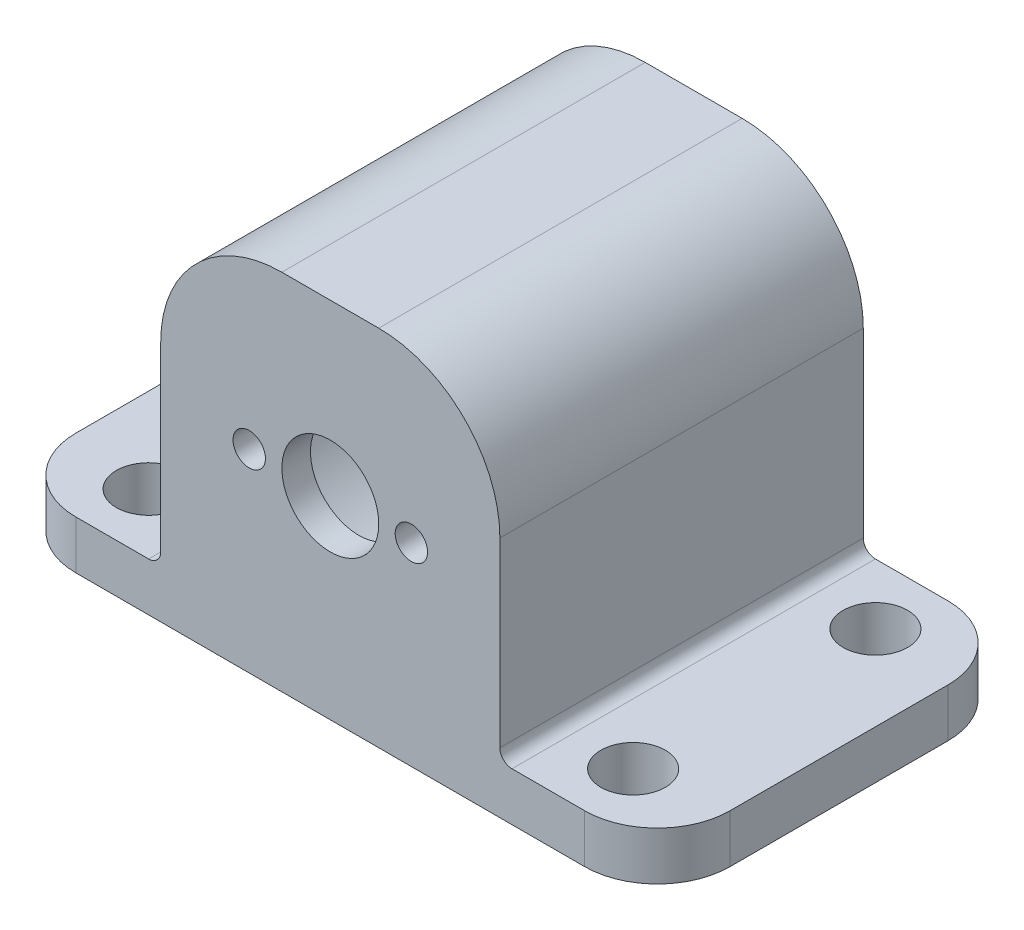
ISO-10303-21;
HEADER;
FILE_DESCRIPTION(('STEP AP214'),'2;1');
FILE_NAME('part.step','',(''),(''),'','','');
FILE_SCHEMA(('AUTOMOTIVE_DESIGN { 1 0 10303 214 1 1 1 1 }'));
ENDSEC;
DATA;
#1=APPLICATION_CONTEXT('core data for automotive mechanical design processes');
#2=APPLICATION_PROTOCOL_DEFINITION('international standard','automotive_design',2000,#1);
#3=PRODUCT_CONTEXT('',#1,'mechanical');
#4=PRODUCT('Part','Part','',(#3));
#5=PRODUCT_RELATED_PRODUCT_CATEGORY('part','',(#4));
#6=PRODUCT_DEFINITION_FORMATION('','',#4);
#7=PRODUCT_DEFINITION_CONTEXT('part definition',#1,'design');
#8=PRODUCT_DEFINITION('design','',#6,#7);
#9=PRODUCT_DEFINITION_SHAPE('','',#8);
#10=(LENGTH_UNIT() NAMED_UNIT(*) SI_UNIT(.MILLI.,.METRE.));
#11=(NAMED_UNIT(*) PLANE_ANGLE_UNIT() SI_UNIT($,.RADIAN.));
#12=(NAMED_UNIT(*) SI_UNIT($,.STERADIAN.) SOLID_ANGLE_UNIT());
#13=UNCERTAINTY_MEASURE_WITH_UNIT(LENGTH_MEASURE(1.E-05),#10,'distance_accuracy_value','');
#14=(GEOMETRIC_REPRESENTATION_CONTEXT(3) GLOBAL_UNCERTAINTY_ASSIGNED_CONTEXT((#13)) GLOBAL_UNIT_ASSIGNED_CONTEXT((#10,
#11,#12)) REPRESENTATION_CONTEXT('',''));
#15=CARTESIAN_POINT('',(0.,0.,0.));
#16=DIRECTION('',(0.,0.,1.));
#17=DIRECTION('',(1.,0.,0.));
#18=AXIS2_PLACEMENT_3D('',#15,#16,#17);
#19=CARTESIAN_POINT('',(0.,20.32,38.1));
#20=DIRECTION('',(0.,0.,-1.));
#21=DIRECTION('',(-1.,0.,0.));
#22=AXIS2_PLACEMENT_3D('',#19,#20,#21);
#23=CYLINDRICAL_SURFACE('',#22,14.224);
#24=CARTESIAN_POINT('',(0.,20.32,1.26999999999996));
#25=DIRECTION('',(0.,0.,1.));
#26=DIRECTION('',(1.,0.,0.));
#27=AXIS2_PLACEMENT_3D('',#24,#25,#26);
#28=CIRCLE('',#27,14.224);
#29=CARTESIAN_POINT('',(-14.224,20.32,1.26999999999995));
#30=VERTEX_POINT('',#29);
#31=EDGE_CURVE('E12',#30,#30,#28,.F.);
#32=CARTESIAN_POINT('',(0.,20.32,35.1));
#33=DIRECTION('',(0.,0.,1.));
#34=DIRECTION('',(1.,0.,0.));
#35=AXIS2_PLACEMENT_3D('',#32,#33,#34);
#36=CIRCLE('',#35,14.224);
#37=CARTESIAN_POINT('',(-14.224,20.32,35.1));
#38=VERTEX_POINT('',#37);
#39=EDGE_CURVE('E296',#38,#38,#36,.T.);
#40=CARTESIAN_POINT('',(-14.224,20.32,1.26999999999995));
#41=CARTESIAN_POINT('',(-14.224,20.32,1.62239583333329));
#42=CARTESIAN_POINT('',(-14.224,20.32,1.97479166666662));
#43=CARTESIAN_POINT('',(-14.224,20.32,2.67958333333329));
#44=CARTESIAN_POINT('',(-14.224,20.32,3.03197916666662));
#45=CARTESIAN_POINT('',(-14.224,20.32,3.73677083333329));
#46=CARTESIAN_POINT('',(-14.224,20.32,4.08916666666662));
#47=CARTESIAN_POINT('',(-14.224,20.32,4.79395833333329));
#48=CARTESIAN_POINT('',(-14.224,20.32,5.14635416666662));
#49=CARTESIAN_POINT('',(-14.224,20.32,5.85114583333329));
#50=CARTESIAN_POINT('',(-14.224,20.32,6.20354166666663));
#51=CARTESIAN_POINT('',(-14.224,20.32,6.9083333333333));
#52=CARTESIAN_POINT('',(-14.224,20.32,7.26072916666663));
#53=CARTESIAN_POINT('',(-14.224,20.32,7.96552083333329));
#54=CARTESIAN_POINT('',(-14.224,20.32,8.31791666666663));
#55=CARTESIAN_POINT('',(-14.224,20.32,9.02270833333329));
#56=CARTESIAN_POINT('',(-14.224,20.32,9.37510416666663));
#57=CARTESIAN_POINT('',(-14.224,20.32,10.0798958333333));
#58=CARTESIAN_POINT('',(-14.224,20.32,10.4322916666666));
#59=CARTESIAN_POINT('',(-14.224,20.32,11.1370833333333));
#60=CARTESIAN_POINT('',(-14.224,20.32,11.4894791666666));
#61=CARTESIAN_POINT('',(-14.224,20.32,12.1942708333333));
#62=CARTESIAN_POINT('',(-14.224,20.32,12.5466666666666));
#63=CARTESIAN_POINT('',(-14.224,20.32,13.2514583333333));
#64=CARTESIAN_POINT('',(-14.224,20.32,13.6038541666666));
#65=CARTESIAN_POINT('',(-14.224,20.32,14.3086458333333));
#66=CARTESIAN_POINT('',(-14.224,20.32,14.6610416666666));
#67=CARTESIAN_POINT('',(-14.224,20.32,15.3658333333333));
#68=CARTESIAN_POINT('',(-14.224,20.32,15.7182291666666));
#69=CARTESIAN_POINT('',(-14.224,20.32,16.4230208333333));
#70=CARTESIAN_POINT('',(-14.224,20.32,16.7754166666666));
#71=CARTESIAN_POINT('',(-14.224,20.32,17.4802083333333));
#72=CARTESIAN_POINT('',(-14.224,20.32,17.8326041666666));
#73=CARTESIAN_POINT('',(-14.224,20.32,18.5373958333333));
#74=CARTESIAN_POINT('',(-14.224,20.32,18.8897916666666));
#75=CARTESIAN_POINT('',(-14.224,20.32,19.5945833333333));
#76=CARTESIAN_POINT('',(-14.224,20.32,19.9469791666666));
#77=CARTESIAN_POINT('',(-14.224,20.32,20.6517708333333));
#78=CARTESIAN_POINT('',(-14.224,20.32,21.0041666666666));
#79=CARTESIAN_POINT('',(-14.224,20.32,21.7089583333333));
#80=CARTESIAN_POINT('',(-14.224,20.32,22.0613541666666));
#81=CARTESIAN_POINT('',(-14.224,20.32,22.7661458333333));
#82=CARTESIAN_POINT('',(-14.224,20.32,23.1185416666666));
#83=CARTESIAN_POINT('',(-14.224,20.32,23.8233333333333));
#84=CARTESIAN_POINT('',(-14.224,20.32,24.1757291666666));
#85=CARTESIAN_POINT('',(-14.224,20.32,24.8805208333333));
#86=CARTESIAN_POINT('',(-14.224,20.32,25.2329166666667));
#87=CARTESIAN_POINT('',(-14.224,20.32,25.9377083333333));
#88=CARTESIAN_POINT('',(-14.224,20.32,26.2901041666667));
#89=CARTESIAN_POINT('',(-14.224,20.32,26.9948958333333));
#90=CARTESIAN_POINT('',(-14.224,20.32,27.3472916666667));
#91=CARTESIAN_POINT('',(-14.224,20.32,28.0520833333333));
#92=CARTESIAN_POINT('',(-14.224,20.32,28.4044791666667));
#93=CARTESIAN_POINT('',(-14.224,20.32,29.1092708333333));
#94=CARTESIAN_POINT('',(-14.224,20.32,29.4616666666667));
#95=CARTESIAN_POINT('',(-14.224,20.32,30.1664583333333));
#96=CARTESIAN_POINT('',(-14.224,20.32,30.5188541666667));
#97=CARTESIAN_POINT('',(-14.224,20.32,31.2236458333333));
#98=CARTESIAN_POINT('',(-14.224,20.32,31.5760416666667));
#99=CARTESIAN_POINT('',(-14.224,20.32,32.2808333333333));
#100=CARTESIAN_POINT('',(-14.224,20.32,32.6332291666667));
#101=CARTESIAN_POINT('',(-14.224,20.32,33.3380208333333));
#102=CARTESIAN_POINT('',(-14.224,20.32,33.6904166666667));
#103=CARTESIAN_POINT('',(-14.224,20.32,34.3952083333333));
#104=CARTESIAN_POINT('',(-14.224,20.32,34.7476041666667));
#105=CARTESIAN_POINT('',(-14.224,20.32,35.1));
#106=B_SPLINE_CURVE_WITH_KNOTS('',3,(#40,#41,#42,#43,#44,#45,#46,#47,#48,#49,#50,#51,#52,#53,
#54,#55,#56,#57,#58,#59,#60,#61,#62,#63,#64,#65,#66,#67,#68,#69,#70,#71,#72,#73,#74,#75,#76,#77,
#78,#79,#80,#81,#82,#83,#84,#85,#86,#87,#88,#89,#90,#91,#92,#93,#94,#95,#96,#97,#98,#99,#100,
#101,#102,#103,#104,#105),.UNSPECIFIED.,.F.,.F.,(4,2,2,2,2,2,2,2,2,2,2,2,2,2,2,2,2,2,2,2,2,2,2,
2,2,2,2,2,2,2,2,2,4),(0.,1.0571875,2.114375,3.1715625,4.22875,5.28593750000001,6.34312500000001,
7.40031250000001,8.45750000000001,9.51468750000001,10.571875,11.6290625,12.68625,13.7434375,
14.800625,15.8578125,16.915,17.9721875,19.029375,20.0865625,21.14375,22.2009375,23.258125,
24.3153125,25.3725,26.4296875,27.486875,28.5440625,29.60125,30.6584375,31.715625,32.7728125,
33.83),.UNSPECIFIED.);
#107=EDGE_CURVE('BSEAM80',#30,#38,#106,.T.);
#108=ORIENTED_EDGE('',*,*,#31,.T.);
#109=ORIENTED_EDGE('',*,*,#39,.T.);
#110=ORIENTED_EDGE('',*,*,#107,.T.);
#111=ORIENTED_EDGE('',*,*,#107,.F.);
#112=EDGE_LOOP('',(#108,#110,#109,#111));
#113=FACE_BOUND('',#112,.T.);
#114=ADVANCED_FACE('F80',(#113),#23,.F.);
#115=CARTESIAN_POINT('',(-19.05,6.35,38.1));
#116=DIRECTION('',(0.,0.,1.));
#117=DIRECTION('',(1.,0.,0.));
#118=AXIS2_PLACEMENT_3D('',#115,#116,#117);
#119=PLANE('',#118);
#120=DIRECTION('',(1.,0.,0.));
#121=VECTOR('',#120,1.);
#122=CARTESIAN_POINT('',(-34.29,0.,38.1));
#123=LINE('',#122,#121);
#124=CARTESIAN_POINT('',(-26.67,0.,38.1));
#125=VERTEX_POINT('',#124);
#126=CARTESIAN_POINT('',(26.67,0.,38.1));
#127=VERTEX_POINT('',#126);
#128=EDGE_CURVE('E246',#125,#127,#123,.T.);
#129=ORIENTED_EDGE('',*,*,#128,.T.);
#130=DIRECTION('',(0.,1.,0.));
#131=VECTOR('',#130,1.);
#132=CARTESIAN_POINT('',(26.67,5.08000000000001,38.1));
#133=LINE('',#132,#131);
#134=CARTESIAN_POINT('',(26.67,5.08000000000001,38.1));
#135=VERTEX_POINT('',#134);
#136=EDGE_CURVE('E324',#127,#135,#133,.T.);
#137=ORIENTED_EDGE('',*,*,#136,.T.);
#138=DIRECTION('',(-1.,0.,0.));
#139=VECTOR('',#138,1.);
#140=CARTESIAN_POINT('',(34.29,5.08000000000001,38.1));
#141=LINE('',#140,#139);
#142=CARTESIAN_POINT('',(19.05,5.08000000000001,38.1));
#143=VERTEX_POINT('',#142);
#144=EDGE_CURVE('E244',#135,#143,#141,.T.);
#145=ORIENTED_EDGE('',*,*,#144,.T.);
#146=CARTESIAN_POINT('',(19.05,6.35000000000001,38.1));
#147=DIRECTION('',(0.,0.,-1.));
#148=DIRECTION('',(-1.,0.,0.));
#149=AXIS2_PLACEMENT_3D('',#146,#147,#148);
#150=CIRCLE('',#149,1.27);
#151=CARTESIAN_POINT('',(17.78,6.35000000000002,38.1));
#152=VERTEX_POINT('',#151);
#153=EDGE_CURVE('E241',#143,#152,#150,.T.);
#154=ORIENTED_EDGE('',*,*,#153,.T.);
#155=DIRECTION('',(0.,1.,0.));
#156=VECTOR('',#155,1.);
#157=CARTESIAN_POINT('',(17.78,20.32,38.1));
#158=LINE('',#157,#156);
#159=CARTESIAN_POINT('',(17.78,25.4,38.1));
#160=VERTEX_POINT('',#159);
#161=EDGE_CURVE('E239',#152,#160,#158,.T.);
#162=ORIENTED_EDGE('',*,*,#161,.T.);
#163=CARTESIAN_POINT('',(5.08,25.4,38.1));
#164=DIRECTION('',(0.,0.,1.));
#165=DIRECTION('',(1.,0.,0.));
#166=AXIS2_PLACEMENT_3D('',#163,#164,#165);
#167=CIRCLE('',#166,12.7);
#168=CARTESIAN_POINT('',(5.08,38.1,38.1));
#169=VERTEX_POINT('',#168);
#170=EDGE_CURVE('E237',#160,#169,#167,.T.);
#171=ORIENTED_EDGE('',*,*,#170,.T.);
#172=DIRECTION('',(1.,0.,0.));
#173=VECTOR('',#172,1.);
#174=CARTESIAN_POINT('',(-5.08,38.1,38.1));
#175=LINE('',#174,#173);
#176=CARTESIAN_POINT('',(-5.08,38.1,38.1));
#177=VERTEX_POINT('',#176);
#178=EDGE_CURVE('E234',#177,#169,#175,.T.);
#179=ORIENTED_EDGE('',*,*,#178,.F.);
#180=CARTESIAN_POINT('',(-5.08,25.4,38.1));
#181=DIRECTION('',(0.,0.,1.));
#182=DIRECTION('',(1.,0.,0.));
#183=AXIS2_PLACEMENT_3D('',#180,#181,#182);
#184=CIRCLE('',#183,12.7);
#185=CARTESIAN_POINT('',(-17.78,25.4,38.1));
#186=VERTEX_POINT('',#185);
#187=EDGE_CURVE('E218',#177,#186,#184,.T.);
#188=ORIENTED_EDGE('',*,*,#187,.T.);
#189=DIRECTION('',(0.,1.,0.));
#190=VECTOR('',#189,1.);
#191=CARTESIAN_POINT('',(-17.78,6.35000000000001,38.1));
#192=LINE('',#191,#190);
#193=CARTESIAN_POINT('',(-17.78,6.35000000000001,38.1));
#194=VERTEX_POINT('',#193);
#195=EDGE_CURVE('E198',#194,#186,#192,.T.);
#196=ORIENTED_EDGE('',*,*,#195,.F.);
#197=CARTESIAN_POINT('',(-19.05,6.35,38.1));
#198=DIRECTION('',(0.,0.,1.));
#199=DIRECTION('',(1.,0.,0.));
#200=AXIS2_PLACEMENT_3D('',#197,#198,#199);
#201=CIRCLE('',#200,1.27);
#202=CARTESIAN_POINT('',(-19.05,5.08,38.1));
#203=VERTEX_POINT('',#202);
#204=EDGE_CURVE('E215',#203,#194,#201,.T.);
#205=ORIENTED_EDGE('',*,*,#204,.F.);
#206=DIRECTION('',(1.,0.,0.));
#207=VECTOR('',#206,1.);
#208=CARTESIAN_POINT('',(-34.29,5.08,38.1));
#209=LINE('',#208,#207);
#210=CARTESIAN_POINT('',(-26.67,5.08,38.1));
#211=VERTEX_POINT('',#210);
#212=EDGE_CURVE('E207',#211,#203,#209,.T.);
#213=ORIENTED_EDGE('',*,*,#212,.F.);
#214=DIRECTION('',(0.,1.,0.));
#215=VECTOR('',#214,1.);
#216=CARTESIAN_POINT('',(-26.67,6.35,38.1));
#217=LINE('',#216,#215);
#218=EDGE_CURVE('E322',#211,#125,#217,.F.);
#219=ORIENTED_EDGE('',*,*,#218,.T.);
#220=EDGE_LOOP('',(#129,#137,#145,#154,#162,#171,#179,#188,#196,#205,#213,#219));
#221=FACE_BOUND('',#220,.T.);
#222=CARTESIAN_POINT('',(0.,20.32,38.1));
#223=DIRECTION('',(0.,0.,1.));
#224=DIRECTION('',(1.,0.,0.));
#225=AXIS2_PLACEMENT_3D('',#222,#223,#224);
#226=CIRCLE('',#225,5.08);
#227=CARTESIAN_POINT('',(5.08,20.32,38.1));
#228=VERTEX_POINT('',#227);
#229=EDGE_CURVE('E664',#228,#228,#226,.T.);
#230=ORIENTED_EDGE('',*,*,#229,.F.);
#231=EDGE_LOOP('',(#230));
#232=FACE_BOUND('',#231,.T.);
#233=CARTESIAN_POINT('',(8.5,20.32,38.1));
#234=DIRECTION('',(0.,0.,1.));
#235=DIRECTION('',(1.,0.,0.));
#236=AXIS2_PLACEMENT_3D('',#233,#234,#235);
#237=CIRCLE('',#236,1.7);
#238=CARTESIAN_POINT('',(10.2,20.32,38.1));
#239=VERTEX_POINT('',#238);
#240=EDGE_CURVE('E658',#239,#239,#237,.T.);
#241=ORIENTED_EDGE('',*,*,#240,.F.);
#242=EDGE_LOOP('',(#241));
#243=FACE_BOUND('',#242,.T.);
#244=CARTESIAN_POINT('',(-8.5,20.32,38.1));
#245=DIRECTION('',(0.,0.,1.));
#246=DIRECTION('',(1.,0.,0.));
#247=AXIS2_PLACEMENT_3D('',#244,#245,#246);
#248=CIRCLE('',#247,1.7);
#249=CARTESIAN_POINT('',(-6.8,20.32,38.1));
#250=VERTEX_POINT('',#249);
#251=EDGE_CURVE('E655',#250,#250,#248,.T.);
#252=ORIENTED_EDGE('',*,*,#251,.F.);
#253=EDGE_LOOP('',(#252));
#254=FACE_BOUND('',#253,.T.);
#255=ADVANCED_FACE('F212',(#221,#232,#243,#254),#119,.T.);
#256=CARTESIAN_POINT('',(-19.05,6.35,0.));
#257=DIRECTION('',(0.,0.,1.));
#258=DIRECTION('',(1.,0.,0.));
#259=AXIS2_PLACEMENT_3D('',#256,#257,#258);
#260=PLANE('',#259);
#261=CARTESIAN_POINT('',(0.,20.32,0.));
#262=DIRECTION('',(0.,0.,1.));
#263=DIRECTION('',(1.,0.,0.));
#264=AXIS2_PLACEMENT_3D('',#261,#262,#263);
#265=CIRCLE('',#264,15.494);
#266=CARTESIAN_POINT('',(15.494,20.32,0.));
#267=VERTEX_POINT('',#266);
#268=EDGE_CURVE('E89',#267,#267,#265,.T.);
#269=ORIENTED_EDGE('',*,*,#268,.T.);
#270=EDGE_LOOP('',(#269));
#271=FACE_BOUND('',#270,.T.);
#272=DIRECTION('',(-1.,0.,0.));
#273=VECTOR('',#272,1.);
#274=CARTESIAN_POINT('',(34.29,5.08000000000001,0.));
#275=LINE('',#274,#273);
#276=CARTESIAN_POINT('',(26.67,5.08000000000001,0.));
#277=VERTEX_POINT('',#276);
#278=CARTESIAN_POINT('',(19.05,5.08000000000001,0.));
#279=VERTEX_POINT('',#278);
#280=EDGE_CURVE('E265',#277,#279,#275,.T.);
#281=ORIENTED_EDGE('',*,*,#280,.F.);
#282=DIRECTION('',(0.,1.,0.));
#283=VECTOR('',#282,1.);
#284=CARTESIAN_POINT('',(26.67,6.35,0.));
#285=LINE('',#284,#283);
#286=CARTESIAN_POINT('',(26.67,0.,0.));
#287=VERTEX_POINT('',#286);
#288=EDGE_CURVE('E312',#277,#287,#285,.F.);
#289=ORIENTED_EDGE('',*,*,#288,.T.);
#290=DIRECTION('',(1.,0.,0.));
#291=VECTOR('',#290,1.);
#292=CARTESIAN_POINT('',(-34.29,0.,0.));
#293=LINE('',#292,#291);
#294=CARTESIAN_POINT('',(-26.67,0.,0.));
#295=VERTEX_POINT('',#294);
#296=EDGE_CURVE('E227',#295,#287,#293,.T.);
#297=ORIENTED_EDGE('',*,*,#296,.F.);
#298=DIRECTION('',(0.,1.,0.));
#299=VECTOR('',#298,1.);
#300=CARTESIAN_POINT('',(-26.67,5.08,0.));
#301=LINE('',#300,#299);
#302=CARTESIAN_POINT('',(-26.67,5.08,0.));
#303=VERTEX_POINT('',#302);
#304=EDGE_CURVE('E309',#295,#303,#301,.T.);
#305=ORIENTED_EDGE('',*,*,#304,.T.);
#306=DIRECTION('',(1.,0.,0.));
#307=VECTOR('',#306,1.);
#308=CARTESIAN_POINT('',(-34.29,5.08,0.));
#309=LINE('',#308,#307);
#310=CARTESIAN_POINT('',(-19.05,5.08,0.));
#311=VERTEX_POINT('',#310);
#312=EDGE_CURVE('E225',#303,#311,#309,.T.);
#313=ORIENTED_EDGE('',*,*,#312,.T.);
#314=CARTESIAN_POINT('',(-19.05,6.35,0.));
#315=DIRECTION('',(0.,0.,1.));
#316=DIRECTION('',(1.,0.,0.));
#317=AXIS2_PLACEMENT_3D('',#314,#315,#316);
#318=CIRCLE('',#317,1.27);
#319=CARTESIAN_POINT('',(-17.78,6.35000000000001,0.));
#320=VERTEX_POINT('',#319);
#321=EDGE_CURVE('E249',#311,#320,#318,.T.);
#322=ORIENTED_EDGE('',*,*,#321,.T.);
#323=DIRECTION('',(0.,1.,0.));
#324=VECTOR('',#323,1.);
#325=CARTESIAN_POINT('',(-17.78,20.32,0.));
#326=LINE('',#325,#324);
#327=CARTESIAN_POINT('',(-17.78,25.4,0.));
#328=VERTEX_POINT('',#327);
#329=EDGE_CURVE('E201',#320,#328,#326,.T.);
#330=ORIENTED_EDGE('',*,*,#329,.T.);
#331=CARTESIAN_POINT('',(-5.08,25.4,0.));
#332=DIRECTION('',(0.,0.,1.));
#333=DIRECTION('',(1.,0.,0.));
#334=AXIS2_PLACEMENT_3D('',#331,#332,#333);
#335=CIRCLE('',#334,12.7);
#336=CARTESIAN_POINT('',(-5.08,38.1,0.));
#337=VERTEX_POINT('',#336);
#338=EDGE_CURVE('E252',#337,#328,#335,.T.);
#339=ORIENTED_EDGE('',*,*,#338,.F.);
#340=DIRECTION('',(1.,0.,0.));
#341=VECTOR('',#340,1.);
#342=CARTESIAN_POINT('',(-5.08,38.1,0.));
#343=LINE('',#342,#341);
#344=CARTESIAN_POINT('',(5.08,38.1,0.));
#345=VERTEX_POINT('',#344);
#346=EDGE_CURVE('E255',#337,#345,#343,.T.);
#347=ORIENTED_EDGE('',*,*,#346,.T.);
#348=CARTESIAN_POINT('',(5.08,25.4,0.));
#349=DIRECTION('',(0.,0.,1.));
#350=DIRECTION('',(1.,0.,0.));
#351=AXIS2_PLACEMENT_3D('',#348,#349,#350);
#352=CIRCLE('',#351,12.7);
#353=CARTESIAN_POINT('',(17.78,25.4,0.));
#354=VERTEX_POINT('',#353);
#355=EDGE_CURVE('E258',#354,#345,#352,.T.);
#356=ORIENTED_EDGE('',*,*,#355,.F.);
#357=DIRECTION('',(0.,1.,0.));
#358=VECTOR('',#357,1.);
#359=CARTESIAN_POINT('',(17.78,6.35000000000002,0.));
#360=LINE('',#359,#358);
#361=CARTESIAN_POINT('',(17.78,6.35000000000002,0.));
#362=VERTEX_POINT('',#361);
#363=EDGE_CURVE('E261',#362,#354,#360,.T.);
#364=ORIENTED_EDGE('',*,*,#363,.F.);
#365=CARTESIAN_POINT('',(19.05,6.35000000000001,0.));
#366=DIRECTION('',(0.,0.,-1.));
#367=DIRECTION('',(-1.,0.,0.));
#368=AXIS2_PLACEMENT_3D('',#365,#366,#367);
#369=CIRCLE('',#368,1.27);
#370=EDGE_CURVE('E263',#279,#362,#369,.T.);
#371=ORIENTED_EDGE('',*,*,#370,.F.);
#372=EDGE_LOOP('',(#281,#289,#297,#305,#313,#322,#330,#339,#347,#356,#364,#371));
#373=FACE_BOUND('',#372,.T.);
#374=ADVANCED_FACE('F335',(#271,#373),#260,.F.);
#375=CARTESIAN_POINT('',(-19.05,6.35,38.1));
#376=DIRECTION('',(0.,0.,-1.));
#377=DIRECTION('',(-1.,0.,0.));
#378=AXIS2_PLACEMENT_3D('',#375,#376,#377);
#379=CYLINDRICAL_SURFACE('',#378,1.27);
#380=ORIENTED_EDGE('',*,*,#321,.F.);
#381=DIRECTION('',(0.,0.,-1.));
#382=VECTOR('',#381,1.);
#383=CARTESIAN_POINT('',(-19.05,5.08,38.1));
#384=LINE('',#383,#382);
#385=EDGE_CURVE('E224',#203,#311,#384,.T.);
#386=ORIENTED_EDGE('',*,*,#385,.F.);
#387=ORIENTED_EDGE('',*,*,#204,.T.);
#388=DIRECTION('',(0.,0.,-1.));
#389=VECTOR('',#388,1.);
#390=CARTESIAN_POINT('',(-17.78,6.35000000000001,38.1));
#391=LINE('',#390,#389);
#392=EDGE_CURVE('E195',#194,#320,#391,.T.);
#393=ORIENTED_EDGE('',*,*,#392,.T.);
#394=EDGE_LOOP('',(#380,#386,#387,#393));
#395=FACE_BOUND('',#394,.T.);
#396=ADVANCED_FACE('F222',(#395),#379,.F.);
#397=CARTESIAN_POINT('',(-34.29,5.08,38.1));
#398=DIRECTION('',(0.,1.,0.));
#399=DIRECTION('',(-1.,0.,0.));
#400=AXIS2_PLACEMENT_3D('',#397,#398,#399);
#401=PLANE('',#400);
#402=CARTESIAN_POINT('',(-25.4,5.08000000000001,6.35));
#403=DIRECTION('',(0.,1.,0.));
#404=DIRECTION('',(0.,0.,1.));
#405=AXIS2_PLACEMENT_3D('',#402,#403,#404);
#406=CIRCLE('',#405,3.3782);
#407=CARTESIAN_POINT('',(-25.4,5.08000000000001,9.7282));
#408=VERTEX_POINT('',#407);
#409=EDGE_CURVE('E299',#408,#408,#406,.T.);
#410=ORIENTED_EDGE('',*,*,#409,.F.);
#411=EDGE_LOOP('',(#410));
#412=FACE_BOUND('',#411,.T.);
#413=CARTESIAN_POINT('',(-25.4,5.08000000000001,31.75));
#414=DIRECTION('',(0.,1.,0.));
#415=DIRECTION('',(0.,0.,1.));
#416=AXIS2_PLACEMENT_3D('',#413,#414,#415);
#417=CIRCLE('',#416,3.3782);
#418=CARTESIAN_POINT('',(-25.4,5.08000000000001,35.1282));
#419=VERTEX_POINT('',#418);
#420=EDGE_CURVE('E682',#419,#419,#417,.T.);
#421=ORIENTED_EDGE('',*,*,#420,.F.);
#422=EDGE_LOOP('',(#421));
#423=FACE_BOUND('',#422,.T.);
#424=DIRECTION('',(0.,0.,-1.));
#425=VECTOR('',#424,1.);
#426=CARTESIAN_POINT('',(-34.29,5.08,38.1));
#427=LINE('',#426,#425);
#428=CARTESIAN_POINT('',(-34.29,5.08,30.48));
#429=VERTEX_POINT('',#428);
#430=CARTESIAN_POINT('',(-34.29,5.08,7.62000000000001));
#431=VERTEX_POINT('',#430);
#432=EDGE_CURVE('E271',#429,#431,#427,.T.);
#433=ORIENTED_EDGE('',*,*,#432,.F.);
#434=CARTESIAN_POINT('',(-26.67,5.08,30.48));
#435=DIRECTION('',(0.,1.,0.));
#436=DIRECTION('',(-1.,0.,0.));
#437=AXIS2_PLACEMENT_3D('',#434,#435,#436);
#438=CIRCLE('',#437,7.62);
#439=EDGE_CURVE('E104',#429,#211,#438,.T.);
#440=ORIENTED_EDGE('',*,*,#439,.T.);
#441=ORIENTED_EDGE('',*,*,#212,.T.);
#442=ORIENTED_EDGE('',*,*,#385,.T.);
#443=ORIENTED_EDGE('',*,*,#312,.F.);
#444=CARTESIAN_POINT('',(-26.67,5.08,7.62));
#445=DIRECTION('',(0.,1.,0.));
#446=DIRECTION('',(-1.,0.,0.));
#447=AXIS2_PLACEMENT_3D('',#444,#445,#446);
#448=CIRCLE('',#447,7.62);
#449=EDGE_CURVE('E96',#303,#431,#448,.T.);
#450=ORIENTED_EDGE('',*,*,#449,.T.);
#451=EDGE_LOOP('',(#433,#440,#441,#442,#443,#450));
#452=FACE_BOUND('',#451,.T.);
#453=ADVANCED_FACE('F362',(#412,#423,#452),#401,.T.);
#454=CARTESIAN_POINT('',(-34.29,0.,38.1));
#455=DIRECTION('',(-1.,0.,0.));
#456=DIRECTION('',(0.,0.,1.));
#457=AXIS2_PLACEMENT_3D('',#454,#455,#456);
#458=PLANE('',#457);
#459=DIRECTION('',(0.,0.,-1.));
#460=VECTOR('',#459,1.);
#461=CARTESIAN_POINT('',(-34.29,0.,38.1));
#462=LINE('',#461,#460);
#463=CARTESIAN_POINT('',(-34.29,0.,30.48));
#464=VERTEX_POINT('',#463);
#465=CARTESIAN_POINT('',(-34.29,0.,7.62000000000001));
#466=VERTEX_POINT('',#465);
#467=EDGE_CURVE('E273',#464,#466,#462,.T.);
#468=ORIENTED_EDGE('',*,*,#467,.F.);
#469=DIRECTION('',(0.,1.,0.));
#470=VECTOR('',#469,1.);
#471=CARTESIAN_POINT('',(-34.29,0.,30.48));
#472=LINE('',#471,#470);
#473=EDGE_CURVE('E329',#464,#429,#472,.T.);
#474=ORIENTED_EDGE('',*,*,#473,.T.);
#475=ORIENTED_EDGE('',*,*,#432,.T.);
#476=DIRECTION('',(0.,1.,0.));
#477=VECTOR('',#476,1.);
#478=CARTESIAN_POINT('',(-34.29,0.,7.62));
#479=LINE('',#478,#477);
#480=EDGE_CURVE('E327',#431,#466,#479,.F.);
#481=ORIENTED_EDGE('',*,*,#480,.T.);
#482=EDGE_LOOP('',(#468,#474,#475,#481));
#483=FACE_BOUND('',#482,.T.);
#484=ADVANCED_FACE('F365',(#483),#458,.T.);
#485=CARTESIAN_POINT('',(-34.29,0.,38.1));
#486=DIRECTION('',(0.,1.,0.));
#487=DIRECTION('',(-1.,0.,0.));
#488=AXIS2_PLACEMENT_3D('',#485,#486,#487);
#489=PLANE('',#488);
#490=CARTESIAN_POINT('',(-25.4,0.,6.35));
#491=DIRECTION('',(0.,1.,0.));
#492=DIRECTION('',(0.,0.,1.));
#493=AXIS2_PLACEMENT_3D('',#490,#491,#492);
#494=CIRCLE('',#493,3.3782);
#495=CARTESIAN_POINT('',(-25.4,0.,9.7282));
#496=VERTEX_POINT('',#495);
#497=EDGE_CURVE('E673',#496,#496,#494,.T.);
#498=ORIENTED_EDGE('',*,*,#497,.T.);
#499=EDGE_LOOP('',(#498));
#500=FACE_BOUND('',#499,.T.);
#501=CARTESIAN_POINT('',(25.4,0.,31.75));
#502=DIRECTION('',(0.,1.,0.));
#503=DIRECTION('',(0.,0.,1.));
#504=AXIS2_PLACEMENT_3D('',#501,#502,#503);
#505=CIRCLE('',#504,3.3782);
#506=CARTESIAN_POINT('',(25.4,0.,35.1282));
#507=VERTEX_POINT('',#506);
#508=EDGE_CURVE('E679',#507,#507,#505,.T.);
#509=ORIENTED_EDGE('',*,*,#508,.T.);
#510=EDGE_LOOP('',(#509));
#511=FACE_BOUND('',#510,.T.);
#512=CARTESIAN_POINT('',(-25.4,0.,31.75));
#513=DIRECTION('',(0.,1.,0.));
#514=DIRECTION('',(0.,0.,1.));
#515=AXIS2_PLACEMENT_3D('',#512,#513,#514);
#516=CIRCLE('',#515,3.3782);
#517=CARTESIAN_POINT('',(-25.4,0.,35.1282));
#518=VERTEX_POINT('',#517);
#519=EDGE_CURVE('E685',#518,#518,#516,.T.);
#520=ORIENTED_EDGE('',*,*,#519,.T.);
#521=EDGE_LOOP('',(#520));
#522=FACE_BOUND('',#521,.T.);
#523=CARTESIAN_POINT('',(25.4,0.,6.35));
#524=DIRECTION('',(0.,1.,0.));
#525=DIRECTION('',(0.,0.,1.));
#526=AXIS2_PLACEMENT_3D('',#523,#524,#525);
#527=CIRCLE('',#526,3.3782);
#528=CARTESIAN_POINT('',(25.4,0.,9.7282));
#529=VERTEX_POINT('',#528);
#530=EDGE_CURVE('E230',#529,#529,#527,.T.);
#531=ORIENTED_EDGE('',*,*,#530,.T.);
#532=EDGE_LOOP('',(#531));
#533=FACE_BOUND('',#532,.T.);
#534=ORIENTED_EDGE('',*,*,#296,.T.);
#535=CARTESIAN_POINT('',(26.67,0.,7.62));
#536=DIRECTION('',(0.,1.,0.));
#537=DIRECTION('',(-1.,0.,0.));
#538=AXIS2_PLACEMENT_3D('',#535,#536,#537);
#539=CIRCLE('',#538,7.62);
#540=CARTESIAN_POINT('',(34.29,0.,7.62000000000001));
#541=VERTEX_POINT('',#540);
#542=EDGE_CURVE('E320',#287,#541,#539,.F.);
#543=ORIENTED_EDGE('',*,*,#542,.T.);
#544=DIRECTION('',(0.,0.,-1.));
#545=VECTOR('',#544,1.);
#546=CARTESIAN_POINT('',(34.29,0.,38.1));
#547=LINE('',#546,#545);
#548=CARTESIAN_POINT('',(34.29,0.,30.48));
#549=VERTEX_POINT('',#548);
#550=EDGE_CURVE('E276',#549,#541,#547,.T.);
#551=ORIENTED_EDGE('',*,*,#550,.F.);
#552=CARTESIAN_POINT('',(26.67,0.,30.48));
#553=DIRECTION('',(0.,1.,0.));
#554=DIRECTION('',(-1.,0.,0.));
#555=AXIS2_PLACEMENT_3D('',#552,#553,#554);
#556=CIRCLE('',#555,7.62);
#557=EDGE_CURVE('E318',#549,#127,#556,.F.);
#558=ORIENTED_EDGE('',*,*,#557,.T.);
#559=ORIENTED_EDGE('',*,*,#128,.F.);
#560=CARTESIAN_POINT('',(-26.67,0.,30.48));
#561=DIRECTION('',(0.,1.,0.));
#562=DIRECTION('',(-1.,0.,0.));
#563=AXIS2_PLACEMENT_3D('',#560,#561,#562);
#564=CIRCLE('',#563,7.62);
#565=EDGE_CURVE('E316',#125,#464,#564,.F.);
#566=ORIENTED_EDGE('',*,*,#565,.T.);
#567=ORIENTED_EDGE('',*,*,#467,.T.);
#568=CARTESIAN_POINT('',(-26.67,0.,7.62));
#569=DIRECTION('',(0.,1.,0.));
#570=DIRECTION('',(-1.,0.,0.));
#571=AXIS2_PLACEMENT_3D('',#568,#569,#570);
#572=CIRCLE('',#571,7.62);
#573=EDGE_CURVE('E314',#466,#295,#572,.F.);
#574=ORIENTED_EDGE('',*,*,#573,.T.);
#575=EDGE_LOOP('',(#534,#543,#551,#558,#559,#566,#567,#574));
#576=FACE_BOUND('',#575,.T.);
#577=ADVANCED_FACE('F369',(#500,#511,#522,#533,#576),#489,.F.);
#578=CARTESIAN_POINT('',(34.29,0.,38.1));
#579=DIRECTION('',(-1.,0.,0.));
#580=DIRECTION('',(0.,0.,1.));
#581=AXIS2_PLACEMENT_3D('',#578,#579,#580);
#582=PLANE('',#581);
#583=ORIENTED_EDGE('',*,*,#550,.T.);
#584=DIRECTION('',(0.,1.,0.));
#585=VECTOR('',#584,1.);
#586=CARTESIAN_POINT('',(34.29,0.,7.62));
#587=LINE('',#586,#585);
#588=CARTESIAN_POINT('',(34.29,5.08000000000001,7.62000000000001));
#589=VERTEX_POINT('',#588);
#590=EDGE_CURVE('E302',#541,#589,#587,.T.);
#591=ORIENTED_EDGE('',*,*,#590,.T.);
#592=DIRECTION('',(0.,0.,-1.));
#593=VECTOR('',#592,1.);
#594=CARTESIAN_POINT('',(34.29,5.08000000000001,38.1));
#595=LINE('',#594,#593);
#596=CARTESIAN_POINT('',(34.29,5.08000000000001,30.48));
#597=VERTEX_POINT('',#596);
#598=EDGE_CURVE('E279',#597,#589,#595,.T.);
#599=ORIENTED_EDGE('',*,*,#598,.F.);
#600=DIRECTION('',(0.,1.,0.));
#601=VECTOR('',#600,1.);
#602=CARTESIAN_POINT('',(34.29,0.,30.48));
#603=LINE('',#602,#601);
#604=EDGE_CURVE('E270',#597,#549,#603,.F.);
#605=ORIENTED_EDGE('',*,*,#604,.T.);
#606=EDGE_LOOP('',(#583,#591,#599,#605));
#607=FACE_BOUND('',#606,.T.);
#608=ADVANCED_FACE('F373',(#607),#582,.F.);
#609=CARTESIAN_POINT('',(34.29,5.08000000000001,38.1));
#610=DIRECTION('',(0.,-1.,0.));
#611=DIRECTION('',(1.,0.,0.));
#612=AXIS2_PLACEMENT_3D('',#609,#610,#611);
#613=PLANE('',#612);
#614=CARTESIAN_POINT('',(25.4,5.08,31.75));
#615=DIRECTION('',(0.,1.,0.));
#616=DIRECTION('',(0.,0.,1.));
#617=AXIS2_PLACEMENT_3D('',#614,#615,#616);
#618=CIRCLE('',#617,3.3782);
#619=CARTESIAN_POINT('',(25.4,5.08,35.1282));
#620=VERTEX_POINT('',#619);
#621=EDGE_CURVE('E676',#620,#620,#618,.T.);
#622=ORIENTED_EDGE('',*,*,#621,.F.);
#623=EDGE_LOOP('',(#622));
#624=FACE_BOUND('',#623,.T.);
#625=CARTESIAN_POINT('',(25.4,5.08,6.35));
#626=DIRECTION('',(0.,1.,0.));
#627=DIRECTION('',(0.,0.,1.));
#628=AXIS2_PLACEMENT_3D('',#625,#626,#627);
#629=CIRCLE('',#628,3.3782);
#630=CARTESIAN_POINT('',(25.4,5.08,9.7282));
#631=VERTEX_POINT('',#630);
#632=EDGE_CURVE('E687',#631,#631,#629,.T.);
#633=ORIENTED_EDGE('',*,*,#632,.F.);
#634=EDGE_LOOP('',(#633));
#635=FACE_BOUND('',#634,.T.);
#636=ORIENTED_EDGE('',*,*,#598,.T.);
#637=CARTESIAN_POINT('',(26.67,5.08000000000001,7.62));
#638=DIRECTION('',(0.,-1.,0.));
#639=DIRECTION('',(1.,0.,0.));
#640=AXIS2_PLACEMENT_3D('',#637,#638,#639);
#641=CIRCLE('',#640,7.62);
#642=EDGE_CURVE('E307',#589,#277,#641,.F.);
#643=ORIENTED_EDGE('',*,*,#642,.T.);
#644=ORIENTED_EDGE('',*,*,#280,.T.);
#645=DIRECTION('',(0.,0.,-1.));
#646=VECTOR('',#645,1.);
#647=CARTESIAN_POINT('',(19.05,5.08000000000001,38.1));
#648=LINE('',#647,#646);
#649=EDGE_CURVE('E282',#143,#279,#648,.T.);
#650=ORIENTED_EDGE('',*,*,#649,.F.);
#651=ORIENTED_EDGE('',*,*,#144,.F.);
#652=CARTESIAN_POINT('',(26.67,5.08000000000001,30.48));
#653=DIRECTION('',(0.,-1.,0.));
#654=DIRECTION('',(1.,0.,0.));
#655=AXIS2_PLACEMENT_3D('',#652,#653,#654);
#656=CIRCLE('',#655,7.62);
#657=EDGE_CURVE('E305',#135,#597,#656,.F.);
#658=ORIENTED_EDGE('',*,*,#657,.T.);
#659=EDGE_LOOP('',(#636,#643,#644,#650,#651,#658));
#660=FACE_BOUND('',#659,.T.);
#661=ADVANCED_FACE('F377',(#624,#635,#660),#613,.F.);
#662=CARTESIAN_POINT('',(19.05,6.35000000000001,38.1));
#663=DIRECTION('',(0.,0.,-1.));
#664=DIRECTION('',(-1.,0.,0.));
#665=AXIS2_PLACEMENT_3D('',#662,#663,#664);
#666=CYLINDRICAL_SURFACE('',#665,1.27);
#667=ORIENTED_EDGE('',*,*,#370,.T.);
#668=DIRECTION('',(0.,0.,-1.));
#669=VECTOR('',#668,1.);
#670=CARTESIAN_POINT('',(17.78,6.35000000000002,38.1));
#671=LINE('',#670,#669);
#672=EDGE_CURVE('E285',#152,#362,#671,.T.);
#673=ORIENTED_EDGE('',*,*,#672,.F.);
#674=ORIENTED_EDGE('',*,*,#153,.F.);
#675=ORIENTED_EDGE('',*,*,#649,.T.);
#676=EDGE_LOOP('',(#667,#673,#674,#675));
#677=FACE_BOUND('',#676,.T.);
#678=ADVANCED_FACE('F381',(#677),#666,.F.);
#679=CARTESIAN_POINT('',(17.78,6.35000000000002,38.1));
#680=DIRECTION('',(-1.,0.,0.));
#681=DIRECTION('',(0.,0.,1.));
#682=AXIS2_PLACEMENT_3D('',#679,#680,#681);
#683=PLANE('',#682);
#684=ORIENTED_EDGE('',*,*,#363,.T.);
#685=DIRECTION('',(0.,0.,-1.));
#686=VECTOR('',#685,1.);
#687=CARTESIAN_POINT('',(17.78,25.4,38.1));
#688=LINE('',#687,#686);
#689=EDGE_CURVE('E288',#160,#354,#688,.T.);
#690=ORIENTED_EDGE('',*,*,#689,.F.);
#691=ORIENTED_EDGE('',*,*,#161,.F.);
#692=ORIENTED_EDGE('',*,*,#672,.T.);
#693=EDGE_LOOP('',(#684,#690,#691,#692));
#694=FACE_BOUND('',#693,.T.);
#695=ADVANCED_FACE('F385',(#694),#683,.F.);
#696=CARTESIAN_POINT('',(5.08,25.4,38.1));
#697=DIRECTION('',(0.,0.,-1.));
#698=DIRECTION('',(-1.,0.,0.));
#699=AXIS2_PLACEMENT_3D('',#696,#697,#698);
#700=CYLINDRICAL_SURFACE('',#699,12.7);
#701=ORIENTED_EDGE('',*,*,#355,.T.);
#702=DIRECTION('',(0.,0.,-1.));
#703=VECTOR('',#702,1.);
#704=CARTESIAN_POINT('',(5.08,38.1,38.1));
#705=LINE('',#704,#703);
#706=EDGE_CURVE('E291',#169,#345,#705,.T.);
#707=ORIENTED_EDGE('',*,*,#706,.F.);
#708=ORIENTED_EDGE('',*,*,#170,.F.);
#709=ORIENTED_EDGE('',*,*,#689,.T.);
#710=EDGE_LOOP('',(#701,#707,#708,#709));
#711=FACE_BOUND('',#710,.T.);
#712=ADVANCED_FACE('F389',(#711),#700,.T.);
#713=CARTESIAN_POINT('',(-5.08,38.1,38.1));
#714=DIRECTION('',(0.,1.,0.));
#715=DIRECTION('',(-1.,0.,0.));
#716=AXIS2_PLACEMENT_3D('',#713,#714,#715);
#717=PLANE('',#716);
#718=ORIENTED_EDGE('',*,*,#346,.F.);
#719=DIRECTION('',(0.,0.,-1.));
#720=VECTOR('',#719,1.);
#721=CARTESIAN_POINT('',(-5.08,38.1,38.1));
#722=LINE('',#721,#720);
#723=EDGE_CURVE('E293',#177,#337,#722,.T.);
#724=ORIENTED_EDGE('',*,*,#723,.F.);
#725=ORIENTED_EDGE('',*,*,#178,.T.);
#726=ORIENTED_EDGE('',*,*,#706,.T.);
#727=EDGE_LOOP('',(#718,#724,#725,#726));
#728=FACE_BOUND('',#727,.T.);
#729=ADVANCED_FACE('F393',(#728),#717,.T.);
#730=CARTESIAN_POINT('',(-5.08,25.4,38.1));
#731=DIRECTION('',(0.,0.,-1.));
#732=DIRECTION('',(-1.,0.,0.));
#733=AXIS2_PLACEMENT_3D('',#730,#731,#732);
#734=CYLINDRICAL_SURFACE('',#733,12.7);
#735=ORIENTED_EDGE('',*,*,#338,.T.);
#736=DIRECTION('',(0.,0.,-1.));
#737=VECTOR('',#736,1.);
#738=CARTESIAN_POINT('',(-17.78,25.4,38.1));
#739=LINE('',#738,#737);
#740=EDGE_CURVE('E206',#186,#328,#739,.T.);
#741=ORIENTED_EDGE('',*,*,#740,.F.);
#742=ORIENTED_EDGE('',*,*,#187,.F.);
#743=ORIENTED_EDGE('',*,*,#723,.T.);
#744=EDGE_LOOP('',(#735,#741,#742,#743));
#745=FACE_BOUND('',#744,.T.);
#746=ADVANCED_FACE('F397',(#745),#734,.T.);
#747=CARTESIAN_POINT('',(-17.78,20.32,38.1));
#748=DIRECTION('',(-1.,0.,0.));
#749=DIRECTION('',(0.,-1.,0.));
#750=AXIS2_PLACEMENT_3D('',#747,#748,#749);
#751=PLANE('',#750);
#752=ORIENTED_EDGE('',*,*,#329,.F.);
#753=ORIENTED_EDGE('',*,*,#392,.F.);
#754=ORIENTED_EDGE('',*,*,#195,.T.);
#755=ORIENTED_EDGE('',*,*,#740,.T.);
#756=EDGE_LOOP('',(#752,#753,#754,#755));
#757=FACE_BOUND('',#756,.T.);
#758=ADVANCED_FACE('F197',(#757),#751,.T.);
#759=CARTESIAN_POINT('',(25.4,5.08,6.35));
#760=DIRECTION('',(0.,1.,0.));
#761=DIRECTION('',(0.,0.,1.));
#762=AXIS2_PLACEMENT_3D('',#759,#760,#761);
#763=CYLINDRICAL_SURFACE('',#762,3.3782);
#764=ORIENTED_EDGE('',*,*,#530,.F.);
#765=EDGE_LOOP('',(#764));
#766=FACE_BOUND('',#765,.T.);
#767=ORIENTED_EDGE('',*,*,#632,.T.);
#768=EDGE_LOOP('',(#767));
#769=FACE_BOUND('',#768,.T.);
#770=ADVANCED_FACE('F358',(#766,#769),#763,.F.);
#771=CARTESIAN_POINT('',(-25.4,5.08000000000001,31.75));
#772=DIRECTION('',(0.,1.,0.));
#773=DIRECTION('',(0.,0.,1.));
#774=AXIS2_PLACEMENT_3D('',#771,#772,#773);
#775=CYLINDRICAL_SURFACE('',#774,3.3782);
#776=ORIENTED_EDGE('',*,*,#519,.F.);
#777=EDGE_LOOP('',(#776));
#778=FACE_BOUND('',#777,.T.);
#779=ORIENTED_EDGE('',*,*,#420,.T.);
#780=EDGE_LOOP('',(#779));
#781=FACE_BOUND('',#780,.T.);
#782=ADVANCED_FACE('F526',(#778,#781),#775,.F.);
#783=CARTESIAN_POINT('',(25.4,5.08,31.75));
#784=DIRECTION('',(0.,1.,0.));
#785=DIRECTION('',(0.,0.,1.));
#786=AXIS2_PLACEMENT_3D('',#783,#784,#785);
#787=CYLINDRICAL_SURFACE('',#786,3.3782);
#788=ORIENTED_EDGE('',*,*,#508,.F.);
#789=EDGE_LOOP('',(#788));
#790=FACE_BOUND('',#789,.T.);
#791=ORIENTED_EDGE('',*,*,#621,.T.);
#792=EDGE_LOOP('',(#791));
#793=FACE_BOUND('',#792,.T.);
#794=ADVANCED_FACE('F533',(#790,#793),#787,.F.);
#795=CARTESIAN_POINT('',(-25.4,5.08000000000001,6.35));
#796=DIRECTION('',(0.,1.,0.));
#797=DIRECTION('',(0.,0.,1.));
#798=AXIS2_PLACEMENT_3D('',#795,#796,#797);
#799=CYLINDRICAL_SURFACE('',#798,3.3782);
#800=ORIENTED_EDGE('',*,*,#497,.F.);
#801=EDGE_LOOP('',(#800));
#802=FACE_BOUND('',#801,.T.);
#803=ORIENTED_EDGE('',*,*,#409,.T.);
#804=EDGE_LOOP('',(#803));
#805=FACE_BOUND('',#804,.T.);
#806=ADVANCED_FACE('F540',(#802,#805),#799,.F.);
#807=CARTESIAN_POINT('',(0.,20.32,35.1));
#808=DIRECTION('',(0.,0.,1.));
#809=DIRECTION('',(1.,0.,0.));
#810=AXIS2_PLACEMENT_3D('',#807,#808,#809);
#811=PLANE('',#810);
#812=CARTESIAN_POINT('',(0.,20.32,35.1));
#813=DIRECTION('',(0.,0.,1.));
#814=DIRECTION('',(1.,0.,0.));
#815=AXIS2_PLACEMENT_3D('',#812,#813,#814);
#816=CIRCLE('',#815,5.08);
#817=CARTESIAN_POINT('',(5.08,20.32,35.1));
#818=VERTEX_POINT('',#817);
#819=EDGE_CURVE('E300',#818,#818,#816,.T.);
#820=ORIENTED_EDGE('',*,*,#819,.T.);
#821=EDGE_LOOP('',(#820));
#822=FACE_BOUND('',#821,.T.);
#823=CARTESIAN_POINT('',(8.5,20.32,35.1));
#824=DIRECTION('',(0.,0.,1.));
#825=DIRECTION('',(1.,0.,0.));
#826=AXIS2_PLACEMENT_3D('',#823,#824,#825);
#827=CIRCLE('',#826,1.7);
#828=CARTESIAN_POINT('',(10.2,20.32,35.1));
#829=VERTEX_POINT('',#828);
#830=EDGE_CURVE('E661',#829,#829,#827,.T.);
#831=ORIENTED_EDGE('',*,*,#830,.T.);
#832=EDGE_LOOP('',(#831));
#833=FACE_BOUND('',#832,.T.);
#834=CARTESIAN_POINT('',(-8.5,20.32,35.1));
#835=DIRECTION('',(0.,0.,1.));
#836=DIRECTION('',(1.,0.,0.));
#837=AXIS2_PLACEMENT_3D('',#834,#835,#836);
#838=CIRCLE('',#837,1.7);
#839=CARTESIAN_POINT('',(-6.8,20.32,35.1));
#840=VERTEX_POINT('',#839);
#841=EDGE_CURVE('E652',#840,#840,#838,.T.);
#842=ORIENTED_EDGE('',*,*,#841,.T.);
#843=EDGE_LOOP('',(#842));
#844=FACE_BOUND('',#843,.T.);
#845=ORIENTED_EDGE('',*,*,#39,.F.);
#846=EDGE_LOOP('',(#845));
#847=FACE_BOUND('',#846,.T.);
#848=ADVANCED_FACE('F548',(#822,#833,#844,#847),#811,.F.);
#849=CARTESIAN_POINT('',(0.,20.32,35.1));
#850=DIRECTION('',(0.,0.,1.));
#851=DIRECTION('',(1.,0.,0.));
#852=AXIS2_PLACEMENT_3D('',#849,#850,#851);
#853=CYLINDRICAL_SURFACE('',#852,5.08);
#854=ORIENTED_EDGE('',*,*,#819,.F.);
#855=EDGE_LOOP('',(#854));
#856=FACE_BOUND('',#855,.T.);
#857=ORIENTED_EDGE('',*,*,#229,.T.);
#858=EDGE_LOOP('',(#857));
#859=FACE_BOUND('',#858,.T.);
#860=ADVANCED_FACE('F556',(#856,#859),#853,.F.);
#861=CARTESIAN_POINT('',(8.5,20.32,35.1));
#862=DIRECTION('',(0.,0.,1.));
#863=DIRECTION('',(1.,0.,0.));
#864=AXIS2_PLACEMENT_3D('',#861,#862,#863);
#865=CYLINDRICAL_SURFACE('',#864,1.7);
#866=ORIENTED_EDGE('',*,*,#830,.F.);
#867=EDGE_LOOP('',(#866));
#868=FACE_BOUND('',#867,.T.);
#869=ORIENTED_EDGE('',*,*,#240,.T.);
#870=EDGE_LOOP('',(#869));
#871=FACE_BOUND('',#870,.T.);
#872=ADVANCED_FACE('F564',(#868,#871),#865,.F.);
#873=CARTESIAN_POINT('',(-8.5,20.32,35.1));
#874=DIRECTION('',(0.,0.,1.));
#875=DIRECTION('',(1.,0.,0.));
#876=AXIS2_PLACEMENT_3D('',#873,#874,#875);
#877=CYLINDRICAL_SURFACE('',#876,1.7);
#878=ORIENTED_EDGE('',*,*,#841,.F.);
#879=EDGE_LOOP('',(#878));
#880=FACE_BOUND('',#879,.T.);
#881=ORIENTED_EDGE('',*,*,#251,.T.);
#882=EDGE_LOOP('',(#881));
#883=FACE_BOUND('',#882,.T.);
#884=ADVANCED_FACE('F410',(#880,#883),#877,.F.);
#885=CARTESIAN_POINT('',(26.67,0.,7.62));
#886=DIRECTION('',(0.,1.,0.));
#887=DIRECTION('',(0.,0.,1.));
#888=AXIS2_PLACEMENT_3D('',#885,#886,#887);
#889=CYLINDRICAL_SURFACE('',#888,7.62);
#890=ORIENTED_EDGE('',*,*,#542,.F.);
#891=ORIENTED_EDGE('',*,*,#288,.F.);
#892=ORIENTED_EDGE('',*,*,#642,.F.);
#893=ORIENTED_EDGE('',*,*,#590,.F.);
#894=EDGE_LOOP('',(#890,#891,#892,#893));
#895=FACE_BOUND('',#894,.T.);
#896=ADVANCED_FACE('F406',(#895),#889,.T.);
#897=CARTESIAN_POINT('',(26.67,6.35,30.48));
#898=DIRECTION('',(0.,-1.,0.));
#899=DIRECTION('',(0.,0.,-1.));
#900=AXIS2_PLACEMENT_3D('',#897,#898,#899);
#901=CYLINDRICAL_SURFACE('',#900,7.62);
#902=ORIENTED_EDGE('',*,*,#557,.F.);
#903=ORIENTED_EDGE('',*,*,#604,.F.);
#904=ORIENTED_EDGE('',*,*,#657,.F.);
#905=ORIENTED_EDGE('',*,*,#136,.F.);
#906=EDGE_LOOP('',(#902,#903,#904,#905));
#907=FACE_BOUND('',#906,.T.);
#908=ADVANCED_FACE('F409',(#907),#901,.T.);
#909=CARTESIAN_POINT('',(-26.67,0.,30.48));
#910=DIRECTION('',(0.,1.,0.));
#911=DIRECTION('',(0.,0.,1.));
#912=AXIS2_PLACEMENT_3D('',#909,#910,#911);
#913=CYLINDRICAL_SURFACE('',#912,7.62);
#914=ORIENTED_EDGE('',*,*,#565,.F.);
#915=ORIENTED_EDGE('',*,*,#218,.F.);
#916=ORIENTED_EDGE('',*,*,#439,.F.);
#917=ORIENTED_EDGE('',*,*,#473,.F.);
#918=EDGE_LOOP('',(#914,#915,#916,#917));
#919=FACE_BOUND('',#918,.T.);
#920=ADVANCED_FACE('F344',(#919),#913,.T.);
#921=CARTESIAN_POINT('',(-26.67,6.35,7.62));
#922=DIRECTION('',(0.,-1.,0.));
#923=DIRECTION('',(0.,0.,-1.));
#924=AXIS2_PLACEMENT_3D('',#921,#922,#923);
#925=CYLINDRICAL_SURFACE('',#924,7.62);
#926=ORIENTED_EDGE('',*,*,#573,.F.);
#927=ORIENTED_EDGE('',*,*,#480,.F.);
#928=ORIENTED_EDGE('',*,*,#449,.F.);
#929=ORIENTED_EDGE('',*,*,#304,.F.);
#930=EDGE_LOOP('',(#926,#927,#928,#929));
#931=FACE_BOUND('',#930,.T.);
#932=ADVANCED_FACE('F339',(#931),#925,.T.);
#933=CARTESIAN_POINT('',(0.,20.32,0.));
#934=DIRECTION('',(0.,0.,-1.));
#935=DIRECTION('',(-1.,0.,0.));
#936=AXIS2_PLACEMENT_3D('',#933,#934,#935);
#937=CONICAL_SURFACE('',#936,15.494,0.785398163397445);
#938=ORIENTED_EDGE('',*,*,#31,.F.);
#939=EDGE_LOOP('',(#938));
#940=FACE_BOUND('',#939,.T.);
#941=ORIENTED_EDGE('',*,*,#268,.F.);
#942=EDGE_LOOP('',(#941));
#943=FACE_BOUND('',#942,.T.);
#944=ADVANCED_FACE('F83',(#940,#943),#937,.F.);
#945=CLOSED_SHELL('',(#114,#255,#374,#396,#453,#484,#577,#608,#661,#678,#695,#712,#729,#746,
#758,#770,#782,#794,#806,#848,#860,#872,#884,#896,#908,#920,#932,#944));
#946=MANIFOLD_SOLID_BREP('B2',#945);
#947=ADVANCED_BREP_SHAPE_REPRESENTATION('',(#18,#946),#14);
#948=SHAPE_DEFINITION_REPRESENTATION(#9,#947);
ENDSEC;
END-ISO-10303-21;
